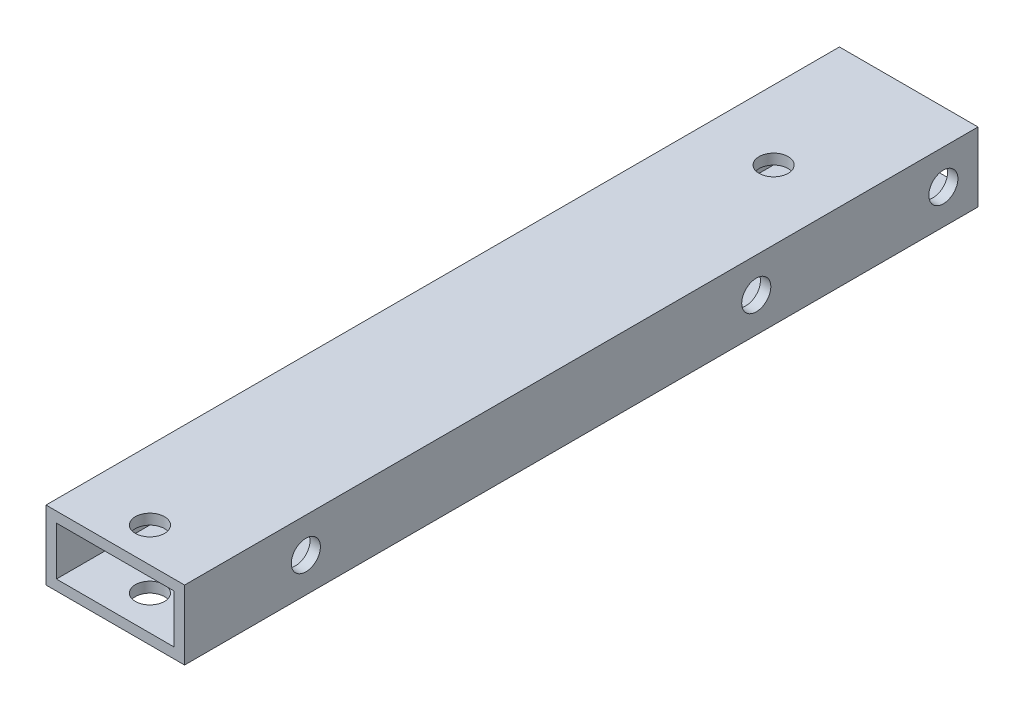
ISO-10303-21;
HEADER;
FILE_DESCRIPTION(('STEP AP214'),'2;1');
FILE_NAME('part.step','',(''),(''),'','','');
FILE_SCHEMA(('AUTOMOTIVE_DESIGN { 1 0 10303 214 1 1 1 1 }'));
ENDSEC;
DATA;
#1=APPLICATION_CONTEXT('core data for automotive mechanical design processes');
#2=APPLICATION_PROTOCOL_DEFINITION('international standard','automotive_design',2000,#1);
#3=PRODUCT_CONTEXT('',#1,'mechanical');
#4=PRODUCT('Part','Part','',(#3));
#5=PRODUCT_RELATED_PRODUCT_CATEGORY('part','',(#4));
#6=PRODUCT_DEFINITION_FORMATION('','',#4);
#7=PRODUCT_DEFINITION_CONTEXT('part definition',#1,'design');
#8=PRODUCT_DEFINITION('design','',#6,#7);
#9=PRODUCT_DEFINITION_SHAPE('','',#8);
#10=(LENGTH_UNIT() NAMED_UNIT(*) SI_UNIT(.MILLI.,.METRE.));
#11=(NAMED_UNIT(*) PLANE_ANGLE_UNIT() SI_UNIT($,.RADIAN.));
#12=(NAMED_UNIT(*) SI_UNIT($,.STERADIAN.) SOLID_ANGLE_UNIT());
#13=UNCERTAINTY_MEASURE_WITH_UNIT(LENGTH_MEASURE(1.E-05),#10,'distance_accuracy_value','');
#14=(GEOMETRIC_REPRESENTATION_CONTEXT(3) GLOBAL_UNCERTAINTY_ASSIGNED_CONTEXT((#13)) GLOBAL_UNIT_ASSIGNED_CONTEXT((#10,
#11,#12)) REPRESENTATION_CONTEXT('',''));
#15=CARTESIAN_POINT('',(0.,0.,0.));
#16=DIRECTION('',(0.,0.,1.));
#17=DIRECTION('',(1.,0.,0.));
#18=AXIS2_PLACEMENT_3D('',#15,#16,#17);
#19=CARTESIAN_POINT('',(0.,0.,114.5));
#20=DIRECTION('',(0.,0.,1.));
#21=DIRECTION('',(1.,0.,0.));
#22=AXIS2_PLACEMENT_3D('',#19,#20,#21);
#23=PLANE('',#22);
#24=DIRECTION('',(0.,1.,0.));
#25=VECTOR('',#24,1.);
#26=CARTESIAN_POINT('',(10.,5.,114.5));
#27=LINE('',#26,#25);
#28=CARTESIAN_POINT('',(10.,-5.,114.5));
#29=VERTEX_POINT('',#28);
#30=CARTESIAN_POINT('',(10.,5.,114.5));
#31=VERTEX_POINT('',#30);
#32=EDGE_CURVE('E164',#29,#31,#27,.T.);
#33=ORIENTED_EDGE('',*,*,#32,.T.);
#34=DIRECTION('',(-1.,0.,0.));
#35=VECTOR('',#34,1.);
#36=CARTESIAN_POINT('',(-10.,5.,114.5));
#37=LINE('',#36,#35);
#38=CARTESIAN_POINT('',(-10.,5.,114.5));
#39=VERTEX_POINT('',#38);
#40=EDGE_CURVE('E167',#31,#39,#37,.T.);
#41=ORIENTED_EDGE('',*,*,#40,.T.);
#42=DIRECTION('',(0.,-1.,0.));
#43=VECTOR('',#42,1.);
#44=CARTESIAN_POINT('',(-10.,5.,114.5));
#45=LINE('',#44,#43);
#46=CARTESIAN_POINT('',(-10.,-5.,114.5));
#47=VERTEX_POINT('',#46);
#48=EDGE_CURVE('E170',#39,#47,#45,.T.);
#49=ORIENTED_EDGE('',*,*,#48,.T.);
#50=DIRECTION('',(1.,0.,0.));
#51=VECTOR('',#50,1.);
#52=CARTESIAN_POINT('',(-10.,-5.,114.5));
#53=LINE('',#52,#51);
#54=EDGE_CURVE('E172',#47,#29,#53,.T.);
#55=ORIENTED_EDGE('',*,*,#54,.T.);
#56=EDGE_LOOP('',(#33,#41,#49,#55));
#57=FACE_BOUND('',#56,.T.);
#58=DIRECTION('',(-1.,0.,0.));
#59=VECTOR('',#58,1.);
#60=CARTESIAN_POINT('',(-10.,3.5,114.5));
#61=LINE('',#60,#59);
#62=CARTESIAN_POINT('',(8.5,3.5,114.5));
#63=VERTEX_POINT('',#62);
#64=CARTESIAN_POINT('',(-8.5,3.5,114.5));
#65=VERTEX_POINT('',#64);
#66=EDGE_CURVE('E134',#63,#65,#61,.T.);
#67=ORIENTED_EDGE('',*,*,#66,.F.);
#68=DIRECTION('',(0.,1.,0.));
#69=VECTOR('',#68,1.);
#70=CARTESIAN_POINT('',(8.5,5.,114.5));
#71=LINE('',#70,#69);
#72=CARTESIAN_POINT('',(8.5,-3.5,114.5));
#73=VERTEX_POINT('',#72);
#74=EDGE_CURVE('E126',#73,#63,#71,.T.);
#75=ORIENTED_EDGE('',*,*,#74,.F.);
#76=DIRECTION('',(1.,0.,0.));
#77=VECTOR('',#76,1.);
#78=CARTESIAN_POINT('',(-10.,-3.5,114.5));
#79=LINE('',#78,#77);
#80=CARTESIAN_POINT('',(-8.5,-3.5,114.5));
#81=VERTEX_POINT('',#80);
#82=EDGE_CURVE('E148',#81,#73,#79,.T.);
#83=ORIENTED_EDGE('',*,*,#82,.F.);
#84=DIRECTION('',(0.,-1.,0.));
#85=VECTOR('',#84,1.);
#86=CARTESIAN_POINT('',(-8.5,5.,114.5));
#87=LINE('',#86,#85);
#88=EDGE_CURVE('E146',#65,#81,#87,.T.);
#89=ORIENTED_EDGE('',*,*,#88,.F.);
#90=EDGE_LOOP('',(#67,#75,#83,#89));
#91=FACE_BOUND('',#90,.T.);
#92=ADVANCED_FACE('F59',(#57,#91),#23,.T.);
#93=CARTESIAN_POINT('',(0.,0.,0.));
#94=DIRECTION('',(0.,0.,1.));
#95=DIRECTION('',(1.,0.,0.));
#96=AXIS2_PLACEMENT_3D('',#93,#94,#95);
#97=PLANE('',#96);
#98=DIRECTION('',(0.,1.,0.));
#99=VECTOR('',#98,1.);
#100=CARTESIAN_POINT('',(10.,5.,0.));
#101=LINE('',#100,#99);
#102=CARTESIAN_POINT('',(10.,-5.,0.));
#103=VERTEX_POINT('',#102);
#104=CARTESIAN_POINT('',(10.,5.,0.));
#105=VERTEX_POINT('',#104);
#106=EDGE_CURVE('E142',#103,#105,#101,.T.);
#107=ORIENTED_EDGE('',*,*,#106,.F.);
#108=DIRECTION('',(1.,0.,0.));
#109=VECTOR('',#108,1.);
#110=CARTESIAN_POINT('',(-10.,-5.,0.));
#111=LINE('',#110,#109);
#112=CARTESIAN_POINT('',(-10.,-5.,0.));
#113=VERTEX_POINT('',#112);
#114=EDGE_CURVE('E168',#113,#103,#111,.T.);
#115=ORIENTED_EDGE('',*,*,#114,.F.);
#116=DIRECTION('',(0.,-1.,0.));
#117=VECTOR('',#116,1.);
#118=CARTESIAN_POINT('',(-10.,5.,0.));
#119=LINE('',#118,#117);
#120=CARTESIAN_POINT('',(-10.,5.,0.));
#121=VERTEX_POINT('',#120);
#122=EDGE_CURVE('E179',#121,#113,#119,.T.);
#123=ORIENTED_EDGE('',*,*,#122,.F.);
#124=DIRECTION('',(-1.,0.,0.));
#125=VECTOR('',#124,1.);
#126=CARTESIAN_POINT('',(-10.,5.,0.));
#127=LINE('',#126,#125);
#128=EDGE_CURVE('E177',#105,#121,#127,.T.);
#129=ORIENTED_EDGE('',*,*,#128,.F.);
#130=EDGE_LOOP('',(#107,#115,#123,#129));
#131=FACE_BOUND('',#130,.T.);
#132=DIRECTION('',(0.,1.,0.));
#133=VECTOR('',#132,1.);
#134=CARTESIAN_POINT('',(8.5,5.,0.));
#135=LINE('',#134,#133);
#136=CARTESIAN_POINT('',(8.5,-3.5,0.));
#137=VERTEX_POINT('',#136);
#138=CARTESIAN_POINT('',(8.5,3.5,0.));
#139=VERTEX_POINT('',#138);
#140=EDGE_CURVE('E84',#137,#139,#135,.T.);
#141=ORIENTED_EDGE('',*,*,#140,.T.);
#142=DIRECTION('',(-1.,0.,0.));
#143=VECTOR('',#142,1.);
#144=CARTESIAN_POINT('',(-10.,3.5,0.));
#145=LINE('',#144,#143);
#146=CARTESIAN_POINT('',(-8.5,3.5,0.));
#147=VERTEX_POINT('',#146);
#148=EDGE_CURVE('E141',#139,#147,#145,.T.);
#149=ORIENTED_EDGE('',*,*,#148,.T.);
#150=DIRECTION('',(0.,-1.,0.));
#151=VECTOR('',#150,1.);
#152=CARTESIAN_POINT('',(-8.5,5.,0.));
#153=LINE('',#152,#151);
#154=CARTESIAN_POINT('',(-8.5,-3.5,0.));
#155=VERTEX_POINT('',#154);
#156=EDGE_CURVE('E156',#147,#155,#153,.T.);
#157=ORIENTED_EDGE('',*,*,#156,.T.);
#158=DIRECTION('',(1.,0.,0.));
#159=VECTOR('',#158,1.);
#160=CARTESIAN_POINT('',(-10.,-3.5,0.));
#161=LINE('',#160,#159);
#162=EDGE_CURVE('E135',#155,#137,#161,.T.);
#163=ORIENTED_EDGE('',*,*,#162,.T.);
#164=EDGE_LOOP('',(#141,#149,#157,#163));
#165=FACE_BOUND('',#164,.T.);
#166=ADVANCED_FACE('F269',(#131,#165),#97,.F.);
#167=CARTESIAN_POINT('',(10.,5.,114.5));
#168=DIRECTION('',(-1.,0.,0.));
#169=DIRECTION('',(0.,-1.,0.));
#170=AXIS2_PLACEMENT_3D('',#167,#168,#169);
#171=PLANE('',#170);
#172=CARTESIAN_POINT('',(10.,0.,5.));
#173=DIRECTION('',(1.,0.,0.));
#174=DIRECTION('',(0.,1.,0.));
#175=AXIS2_PLACEMENT_3D('',#172,#173,#174);
#176=CIRCLE('',#175,2.1);
#177=CARTESIAN_POINT('',(10.,2.1,5.));
#178=VERTEX_POINT('',#177);
#179=EDGE_CURVE('E226',#178,#178,#176,.T.);
#180=ORIENTED_EDGE('',*,*,#179,.F.);
#181=EDGE_LOOP('',(#180));
#182=FACE_BOUND('',#181,.T.);
#183=CARTESIAN_POINT('',(10.,0.,97.));
#184=DIRECTION('',(1.,0.,0.));
#185=DIRECTION('',(0.,1.,0.));
#186=AXIS2_PLACEMENT_3D('',#183,#184,#185);
#187=CIRCLE('',#186,2.1);
#188=CARTESIAN_POINT('',(10.,2.1,97.));
#189=VERTEX_POINT('',#188);
#190=EDGE_CURVE('E236',#189,#189,#187,.T.);
#191=ORIENTED_EDGE('',*,*,#190,.F.);
#192=EDGE_LOOP('',(#191));
#193=FACE_BOUND('',#192,.T.);
#194=CARTESIAN_POINT('',(10.,0.,32.));
#195=DIRECTION('',(1.,0.,0.));
#196=DIRECTION('',(0.,-1.,0.));
#197=AXIS2_PLACEMENT_3D('',#194,#195,#196);
#198=CIRCLE('',#197,2.1);
#199=CARTESIAN_POINT('',(10.,-2.1,32.));
#200=VERTEX_POINT('',#199);
#201=EDGE_CURVE('E233',#200,#200,#198,.T.);
#202=ORIENTED_EDGE('',*,*,#201,.F.);
#203=EDGE_LOOP('',(#202));
#204=FACE_BOUND('',#203,.T.);
#205=ORIENTED_EDGE('',*,*,#106,.T.);
#206=DIRECTION('',(0.,0.,-1.));
#207=VECTOR('',#206,1.);
#208=CARTESIAN_POINT('',(10.,5.,114.5));
#209=LINE('',#208,#207);
#210=EDGE_CURVE('E12',#31,#105,#209,.T.);
#211=ORIENTED_EDGE('',*,*,#210,.F.);
#212=ORIENTED_EDGE('',*,*,#32,.F.);
#213=DIRECTION('',(0.,0.,-1.));
#214=VECTOR('',#213,1.);
#215=CARTESIAN_POINT('',(10.,-5.,114.5));
#216=LINE('',#215,#214);
#217=EDGE_CURVE('E174',#29,#103,#216,.T.);
#218=ORIENTED_EDGE('',*,*,#217,.T.);
#219=EDGE_LOOP('',(#205,#211,#212,#218));
#220=FACE_BOUND('',#219,.T.);
#221=ADVANCED_FACE('F61',(#182,#193,#204,#220),#171,.F.);
#222=CARTESIAN_POINT('',(-10.,5.,114.5));
#223=DIRECTION('',(0.,-1.,0.));
#224=DIRECTION('',(0.,0.,-1.));
#225=AXIS2_PLACEMENT_3D('',#222,#223,#224);
#226=PLANE('',#225);
#227=CARTESIAN_POINT('',(0.,5.,19.5));
#228=DIRECTION('',(0.,1.,0.));
#229=DIRECTION('',(0.,0.,1.));
#230=AXIS2_PLACEMENT_3D('',#227,#228,#229);
#231=CIRCLE('',#230,2.1);
#232=CARTESIAN_POINT('',(0.,5.,21.6));
#233=VERTEX_POINT('',#232);
#234=EDGE_CURVE('E210',#233,#233,#231,.T.);
#235=ORIENTED_EDGE('',*,*,#234,.F.);
#236=EDGE_LOOP('',(#235));
#237=FACE_BOUND('',#236,.T.);
#238=CARTESIAN_POINT('',(0.,5.,109.5));
#239=DIRECTION('',(0.,1.,0.));
#240=DIRECTION('',(0.,0.,1.));
#241=AXIS2_PLACEMENT_3D('',#238,#239,#240);
#242=CIRCLE('',#241,2.1);
#243=CARTESIAN_POINT('',(0.,5.,111.6));
#244=VERTEX_POINT('',#243);
#245=EDGE_CURVE('E220',#244,#244,#242,.T.);
#246=ORIENTED_EDGE('',*,*,#245,.F.);
#247=EDGE_LOOP('',(#246));
#248=FACE_BOUND('',#247,.T.);
#249=ORIENTED_EDGE('',*,*,#128,.T.);
#250=DIRECTION('',(0.,0.,-1.));
#251=VECTOR('',#250,1.);
#252=CARTESIAN_POINT('',(-10.,5.,114.5));
#253=LINE('',#252,#251);
#254=EDGE_CURVE('E68',#39,#121,#253,.T.);
#255=ORIENTED_EDGE('',*,*,#254,.F.);
#256=ORIENTED_EDGE('',*,*,#40,.F.);
#257=ORIENTED_EDGE('',*,*,#210,.T.);
#258=EDGE_LOOP('',(#249,#255,#256,#257));
#259=FACE_BOUND('',#258,.T.);
#260=ADVANCED_FACE('F268',(#237,#248,#259),#226,.F.);
#261=CARTESIAN_POINT('',(-10.,5.,114.5));
#262=DIRECTION('',(1.,0.,0.));
#263=DIRECTION('',(0.,1.,0.));
#264=AXIS2_PLACEMENT_3D('',#261,#262,#263);
#265=PLANE('',#264);
#266=CARTESIAN_POINT('',(-10.,0.,5.));
#267=DIRECTION('',(1.,0.,0.));
#268=DIRECTION('',(0.,1.,0.));
#269=AXIS2_PLACEMENT_3D('',#266,#267,#268);
#270=CIRCLE('',#269,2.1);
#271=CARTESIAN_POINT('',(-10.,2.1,5.));
#272=VERTEX_POINT('',#271);
#273=EDGE_CURVE('E200',#272,#272,#270,.T.);
#274=ORIENTED_EDGE('',*,*,#273,.T.);
#275=EDGE_LOOP('',(#274));
#276=FACE_BOUND('',#275,.T.);
#277=CARTESIAN_POINT('',(-10.,0.,97.));
#278=DIRECTION('',(1.,0.,0.));
#279=DIRECTION('',(0.,1.,0.));
#280=AXIS2_PLACEMENT_3D('',#277,#278,#279);
#281=CIRCLE('',#280,2.1);
#282=CARTESIAN_POINT('',(-10.,2.1,97.));
#283=VERTEX_POINT('',#282);
#284=EDGE_CURVE('E193',#283,#283,#281,.T.);
#285=ORIENTED_EDGE('',*,*,#284,.T.);
#286=EDGE_LOOP('',(#285));
#287=FACE_BOUND('',#286,.T.);
#288=CARTESIAN_POINT('',(-10.,0.,32.));
#289=DIRECTION('',(1.,0.,0.));
#290=DIRECTION('',(0.,-1.,0.));
#291=AXIS2_PLACEMENT_3D('',#288,#289,#290);
#292=CIRCLE('',#291,2.1);
#293=CARTESIAN_POINT('',(-10.,-2.1,32.));
#294=VERTEX_POINT('',#293);
#295=EDGE_CURVE('E239',#294,#294,#292,.T.);
#296=ORIENTED_EDGE('',*,*,#295,.T.);
#297=EDGE_LOOP('',(#296));
#298=FACE_BOUND('',#297,.T.);
#299=ORIENTED_EDGE('',*,*,#122,.T.);
#300=DIRECTION('',(0.,0.,-1.));
#301=VECTOR('',#300,1.);
#302=CARTESIAN_POINT('',(-10.,-5.,114.5));
#303=LINE('',#302,#301);
#304=EDGE_CURVE('E184',#47,#113,#303,.T.);
#305=ORIENTED_EDGE('',*,*,#304,.F.);
#306=ORIENTED_EDGE('',*,*,#48,.F.);
#307=ORIENTED_EDGE('',*,*,#254,.T.);
#308=EDGE_LOOP('',(#299,#305,#306,#307));
#309=FACE_BOUND('',#308,.T.);
#310=ADVANCED_FACE('F287',(#276,#287,#298,#309),#265,.F.);
#311=CARTESIAN_POINT('',(-10.,-5.,114.5));
#312=DIRECTION('',(0.,1.,0.));
#313=DIRECTION('',(0.,0.,1.));
#314=AXIS2_PLACEMENT_3D('',#311,#312,#313);
#315=PLANE('',#314);
#316=CARTESIAN_POINT('',(0.,-5.,19.5));
#317=DIRECTION('',(0.,1.,0.));
#318=DIRECTION('',(0.,0.,1.));
#319=AXIS2_PLACEMENT_3D('',#316,#317,#318);
#320=CIRCLE('',#319,2.1);
#321=CARTESIAN_POINT('',(0.,-5.,21.6));
#322=VERTEX_POINT('',#321);
#323=EDGE_CURVE('E204',#322,#322,#320,.T.);
#324=ORIENTED_EDGE('',*,*,#323,.T.);
#325=EDGE_LOOP('',(#324));
#326=FACE_BOUND('',#325,.T.);
#327=CARTESIAN_POINT('',(0.,-5.,109.5));
#328=DIRECTION('',(0.,1.,0.));
#329=DIRECTION('',(0.,0.,1.));
#330=AXIS2_PLACEMENT_3D('',#327,#328,#329);
#331=CIRCLE('',#330,2.1);
#332=CARTESIAN_POINT('',(0.,-5.,111.6));
#333=VERTEX_POINT('',#332);
#334=EDGE_CURVE('E215',#333,#333,#331,.T.);
#335=ORIENTED_EDGE('',*,*,#334,.T.);
#336=EDGE_LOOP('',(#335));
#337=FACE_BOUND('',#336,.T.);
#338=ORIENTED_EDGE('',*,*,#114,.T.);
#339=ORIENTED_EDGE('',*,*,#217,.F.);
#340=ORIENTED_EDGE('',*,*,#54,.F.);
#341=ORIENTED_EDGE('',*,*,#304,.T.);
#342=EDGE_LOOP('',(#338,#339,#340,#341));
#343=FACE_BOUND('',#342,.T.);
#344=ADVANCED_FACE('F253',(#326,#337,#343),#315,.F.);
#345=CARTESIAN_POINT('',(8.5,5.,114.5));
#346=DIRECTION('',(-1.,0.,0.));
#347=DIRECTION('',(0.,-1.,0.));
#348=AXIS2_PLACEMENT_3D('',#345,#346,#347);
#349=PLANE('',#348);
#350=CARTESIAN_POINT('',(8.5,0.,5.));
#351=DIRECTION('',(-1.,0.,0.));
#352=DIRECTION('',(0.,-1.,0.));
#353=AXIS2_PLACEMENT_3D('',#350,#351,#352);
#354=CIRCLE('',#353,2.1);
#355=CARTESIAN_POINT('',(8.5,2.1,5.));
#356=VERTEX_POINT('',#355);
#357=EDGE_CURVE('E199',#356,#356,#354,.T.);
#358=ORIENTED_EDGE('',*,*,#357,.F.);
#359=EDGE_LOOP('',(#358));
#360=FACE_BOUND('',#359,.T.);
#361=CARTESIAN_POINT('',(8.5,0.,97.));
#362=DIRECTION('',(-1.,0.,0.));
#363=DIRECTION('',(0.,-1.,0.));
#364=AXIS2_PLACEMENT_3D('',#361,#362,#363);
#365=CIRCLE('',#364,2.1);
#366=CARTESIAN_POINT('',(8.5,-2.10000000000001,97.));
#367=VERTEX_POINT('',#366);
#368=EDGE_CURVE('E154',#367,#367,#365,.T.);
#369=ORIENTED_EDGE('',*,*,#368,.F.);
#370=EDGE_LOOP('',(#369));
#371=FACE_BOUND('',#370,.T.);
#372=CARTESIAN_POINT('',(8.5,0.,32.));
#373=DIRECTION('',(-1.,0.,0.));
#374=DIRECTION('',(0.,-1.,0.));
#375=AXIS2_PLACEMENT_3D('',#372,#373,#374);
#376=CIRCLE('',#375,2.1);
#377=CARTESIAN_POINT('',(8.5,-2.1,32.));
#378=VERTEX_POINT('',#377);
#379=EDGE_CURVE('E192',#378,#378,#376,.T.);
#380=ORIENTED_EDGE('',*,*,#379,.F.);
#381=EDGE_LOOP('',(#380));
#382=FACE_BOUND('',#381,.T.);
#383=ORIENTED_EDGE('',*,*,#140,.F.);
#384=DIRECTION('',(0.,0.,-1.));
#385=VECTOR('',#384,1.);
#386=CARTESIAN_POINT('',(8.5,-3.5,114.5));
#387=LINE('',#386,#385);
#388=EDGE_CURVE('E130',#73,#137,#387,.T.);
#389=ORIENTED_EDGE('',*,*,#388,.F.);
#390=ORIENTED_EDGE('',*,*,#74,.T.);
#391=DIRECTION('',(0.,0.,-1.));
#392=VECTOR('',#391,1.);
#393=CARTESIAN_POINT('',(8.5,3.5,114.5));
#394=LINE('',#393,#392);
#395=EDGE_CURVE('E129',#63,#139,#394,.T.);
#396=ORIENTED_EDGE('',*,*,#395,.T.);
#397=EDGE_LOOP('',(#383,#389,#390,#396));
#398=FACE_BOUND('',#397,.T.);
#399=ADVANCED_FACE('F128',(#360,#371,#382,#398),#349,.T.);
#400=CARTESIAN_POINT('',(-10.,3.5,114.5));
#401=DIRECTION('',(0.,-1.,0.));
#402=DIRECTION('',(0.,0.,-1.));
#403=AXIS2_PLACEMENT_3D('',#400,#401,#402);
#404=PLANE('',#403);
#405=CARTESIAN_POINT('',(0.,3.5,19.5));
#406=DIRECTION('',(0.,-1.,0.));
#407=DIRECTION('',(0.,0.,-1.));
#408=AXIS2_PLACEMENT_3D('',#405,#406,#407);
#409=CIRCLE('',#408,2.1);
#410=CARTESIAN_POINT('',(0.,3.5,17.4));
#411=VERTEX_POINT('',#410);
#412=EDGE_CURVE('E223',#411,#411,#409,.T.);
#413=ORIENTED_EDGE('',*,*,#412,.F.);
#414=EDGE_LOOP('',(#413));
#415=FACE_BOUND('',#414,.T.);
#416=CARTESIAN_POINT('',(0.,3.5,109.5));
#417=DIRECTION('',(0.,-1.,0.));
#418=DIRECTION('',(0.,0.,-1.));
#419=AXIS2_PLACEMENT_3D('',#416,#417,#418);
#420=CIRCLE('',#419,2.1);
#421=CARTESIAN_POINT('',(0.,3.5,107.4));
#422=VERTEX_POINT('',#421);
#423=EDGE_CURVE('E203',#422,#422,#420,.T.);
#424=ORIENTED_EDGE('',*,*,#423,.F.);
#425=EDGE_LOOP('',(#424));
#426=FACE_BOUND('',#425,.T.);
#427=ORIENTED_EDGE('',*,*,#148,.F.);
#428=ORIENTED_EDGE('',*,*,#395,.F.);
#429=ORIENTED_EDGE('',*,*,#66,.T.);
#430=DIRECTION('',(0.,0.,-1.));
#431=VECTOR('',#430,1.);
#432=CARTESIAN_POINT('',(-8.5,3.5,114.5));
#433=LINE('',#432,#431);
#434=EDGE_CURVE('E143',#65,#147,#433,.T.);
#435=ORIENTED_EDGE('',*,*,#434,.T.);
#436=EDGE_LOOP('',(#427,#428,#429,#435));
#437=FACE_BOUND('',#436,.T.);
#438=ADVANCED_FACE('F138',(#415,#426,#437),#404,.T.);
#439=CARTESIAN_POINT('',(-8.5,5.,114.5));
#440=DIRECTION('',(1.,0.,0.));
#441=DIRECTION('',(0.,1.,0.));
#442=AXIS2_PLACEMENT_3D('',#439,#440,#441);
#443=PLANE('',#442);
#444=CARTESIAN_POINT('',(-8.5,0.,5.));
#445=DIRECTION('',(1.,0.,0.));
#446=DIRECTION('',(0.,1.,0.));
#447=AXIS2_PLACEMENT_3D('',#444,#445,#446);
#448=CIRCLE('',#447,2.1);
#449=CARTESIAN_POINT('',(-8.5,2.1,5.));
#450=VERTEX_POINT('',#449);
#451=EDGE_CURVE('E197',#450,#450,#448,.T.);
#452=ORIENTED_EDGE('',*,*,#451,.F.);
#453=EDGE_LOOP('',(#452));
#454=FACE_BOUND('',#453,.T.);
#455=CARTESIAN_POINT('',(-8.5,0.,97.));
#456=DIRECTION('',(1.,0.,0.));
#457=DIRECTION('',(0.,1.,0.));
#458=AXIS2_PLACEMENT_3D('',#455,#456,#457);
#459=CIRCLE('',#458,2.1);
#460=CARTESIAN_POINT('',(-8.5,2.1,97.));
#461=VERTEX_POINT('',#460);
#462=EDGE_CURVE('E194',#461,#461,#459,.T.);
#463=ORIENTED_EDGE('',*,*,#462,.F.);
#464=EDGE_LOOP('',(#463));
#465=FACE_BOUND('',#464,.T.);
#466=CARTESIAN_POINT('',(-8.5,0.,32.));
#467=DIRECTION('',(1.,0.,0.));
#468=DIRECTION('',(0.,1.,0.));
#469=AXIS2_PLACEMENT_3D('',#466,#467,#468);
#470=CIRCLE('',#469,2.1);
#471=CARTESIAN_POINT('',(-8.5,2.10000000000001,32.));
#472=VERTEX_POINT('',#471);
#473=EDGE_CURVE('E189',#472,#472,#470,.T.);
#474=ORIENTED_EDGE('',*,*,#473,.F.);
#475=EDGE_LOOP('',(#474));
#476=FACE_BOUND('',#475,.T.);
#477=ORIENTED_EDGE('',*,*,#156,.F.);
#478=ORIENTED_EDGE('',*,*,#434,.F.);
#479=ORIENTED_EDGE('',*,*,#88,.T.);
#480=DIRECTION('',(0.,0.,-1.));
#481=VECTOR('',#480,1.);
#482=CARTESIAN_POINT('',(-8.5,-3.5,114.5));
#483=LINE('',#482,#481);
#484=EDGE_CURVE('E76',#81,#155,#483,.T.);
#485=ORIENTED_EDGE('',*,*,#484,.T.);
#486=EDGE_LOOP('',(#477,#478,#479,#485));
#487=FACE_BOUND('',#486,.T.);
#488=ADVANCED_FACE('F307',(#454,#465,#476,#487),#443,.T.);
#489=CARTESIAN_POINT('',(-10.,-3.5,114.5));
#490=DIRECTION('',(0.,1.,0.));
#491=DIRECTION('',(0.,0.,1.));
#492=AXIS2_PLACEMENT_3D('',#489,#490,#491);
#493=PLANE('',#492);
#494=CARTESIAN_POINT('',(0.,-3.5,19.5));
#495=DIRECTION('',(0.,1.,0.));
#496=DIRECTION('',(0.,0.,1.));
#497=AXIS2_PLACEMENT_3D('',#494,#495,#496);
#498=CIRCLE('',#497,2.1);
#499=CARTESIAN_POINT('',(0.,-3.5,21.6));
#500=VERTEX_POINT('',#499);
#501=EDGE_CURVE('E63',#500,#500,#498,.T.);
#502=ORIENTED_EDGE('',*,*,#501,.F.);
#503=EDGE_LOOP('',(#502));
#504=FACE_BOUND('',#503,.T.);
#505=CARTESIAN_POINT('',(0.,-3.5,109.5));
#506=DIRECTION('',(0.,1.,0.));
#507=DIRECTION('',(0.,0.,1.));
#508=AXIS2_PLACEMENT_3D('',#505,#506,#507);
#509=CIRCLE('',#508,2.1);
#510=CARTESIAN_POINT('',(0.,-3.5,111.6));
#511=VERTEX_POINT('',#510);
#512=EDGE_CURVE('E201',#511,#511,#509,.T.);
#513=ORIENTED_EDGE('',*,*,#512,.F.);
#514=EDGE_LOOP('',(#513));
#515=FACE_BOUND('',#514,.T.);
#516=ORIENTED_EDGE('',*,*,#162,.F.);
#517=ORIENTED_EDGE('',*,*,#484,.F.);
#518=ORIENTED_EDGE('',*,*,#82,.T.);
#519=ORIENTED_EDGE('',*,*,#388,.T.);
#520=EDGE_LOOP('',(#516,#517,#518,#519));
#521=FACE_BOUND('',#520,.T.);
#522=ADVANCED_FACE('F311',(#504,#515,#521),#493,.T.);
#523=CARTESIAN_POINT('',(-10.,0.,32.));
#524=DIRECTION('',(1.,0.,0.));
#525=DIRECTION('',(0.,1.,0.));
#526=AXIS2_PLACEMENT_3D('',#523,#524,#525);
#527=CYLINDRICAL_SURFACE('',#526,2.1);
#528=ORIENTED_EDGE('',*,*,#473,.T.);
#529=EDGE_LOOP('',(#528));
#530=FACE_BOUND('',#529,.T.);
#531=ORIENTED_EDGE('',*,*,#295,.F.);
#532=EDGE_LOOP('',(#531));
#533=FACE_BOUND('',#532,.T.);
#534=ADVANCED_FACE('F263',(#530,#533),#527,.F.);
#535=CARTESIAN_POINT('',(-10.,0.,97.));
#536=DIRECTION('',(1.,0.,0.));
#537=DIRECTION('',(0.,1.,0.));
#538=AXIS2_PLACEMENT_3D('',#535,#536,#537);
#539=CYLINDRICAL_SURFACE('',#538,2.1);
#540=ORIENTED_EDGE('',*,*,#462,.T.);
#541=EDGE_LOOP('',(#540));
#542=FACE_BOUND('',#541,.T.);
#543=ORIENTED_EDGE('',*,*,#284,.F.);
#544=EDGE_LOOP('',(#543));
#545=FACE_BOUND('',#544,.T.);
#546=ADVANCED_FACE('F261',(#542,#545),#539,.F.);
#547=ORIENTED_EDGE('',*,*,#379,.T.);
#548=EDGE_LOOP('',(#547));
#549=FACE_BOUND('',#548,.T.);
#550=ORIENTED_EDGE('',*,*,#201,.T.);
#551=EDGE_LOOP('',(#550));
#552=FACE_BOUND('',#551,.T.);
#553=ADVANCED_FACE('F258',(#549,#552),#527,.F.);
#554=ORIENTED_EDGE('',*,*,#368,.T.);
#555=EDGE_LOOP('',(#554));
#556=FACE_BOUND('',#555,.T.);
#557=ORIENTED_EDGE('',*,*,#190,.T.);
#558=EDGE_LOOP('',(#557));
#559=FACE_BOUND('',#558,.T.);
#560=ADVANCED_FACE('F248',(#556,#559),#539,.F.);
#561=CARTESIAN_POINT('',(-10.,0.,5.));
#562=DIRECTION('',(1.,0.,0.));
#563=DIRECTION('',(0.,1.,0.));
#564=AXIS2_PLACEMENT_3D('',#561,#562,#563);
#565=CYLINDRICAL_SURFACE('',#564,2.1);
#566=CARTESIAN_POINT('',(-8.5,2.1,5.));
#567=CARTESIAN_POINT('',(-8.515625,2.1,5.));
#568=CARTESIAN_POINT('',(-8.53125,2.1,5.));
#569=CARTESIAN_POINT('',(-8.5625,2.1,5.));
#570=CARTESIAN_POINT('',(-8.578125,2.1,5.));
#571=CARTESIAN_POINT('',(-8.609375,2.1,5.));
#572=CARTESIAN_POINT('',(-8.625,2.1,5.));
#573=CARTESIAN_POINT('',(-8.65625,2.1,5.));
#574=CARTESIAN_POINT('',(-8.671875,2.1,5.));
#575=CARTESIAN_POINT('',(-8.703125,2.1,5.));
#576=CARTESIAN_POINT('',(-8.71875,2.1,5.));
#577=CARTESIAN_POINT('',(-8.75,2.1,5.));
#578=CARTESIAN_POINT('',(-8.765625,2.1,5.));
#579=CARTESIAN_POINT('',(-8.796875,2.1,5.));
#580=CARTESIAN_POINT('',(-8.8125,2.1,5.));
#581=CARTESIAN_POINT('',(-8.84375,2.1,5.));
#582=CARTESIAN_POINT('',(-8.859375,2.1,5.));
#583=CARTESIAN_POINT('',(-8.890625,2.1,5.));
#584=CARTESIAN_POINT('',(-8.90625,2.1,5.));
#585=CARTESIAN_POINT('',(-8.9375,2.1,5.));
#586=CARTESIAN_POINT('',(-8.953125,2.1,5.));
#587=CARTESIAN_POINT('',(-8.984375,2.1,5.));
#588=CARTESIAN_POINT('',(-9.,2.1,5.));
#589=CARTESIAN_POINT('',(-9.03125,2.1,5.));
#590=CARTESIAN_POINT('',(-9.046875,2.1,5.));
#591=CARTESIAN_POINT('',(-9.078125,2.1,5.));
#592=CARTESIAN_POINT('',(-9.09375,2.1,5.));
#593=CARTESIAN_POINT('',(-9.125,2.1,5.));
#594=CARTESIAN_POINT('',(-9.140625,2.1,5.));
#595=CARTESIAN_POINT('',(-9.171875,2.1,5.));
#596=CARTESIAN_POINT('',(-9.1875,2.1,5.));
#597=CARTESIAN_POINT('',(-9.21875,2.1,5.));
#598=CARTESIAN_POINT('',(-9.23437500000001,2.1,5.));
#599=CARTESIAN_POINT('',(-9.26562500000001,2.1,5.));
#600=CARTESIAN_POINT('',(-9.28125000000001,2.1,5.));
#601=CARTESIAN_POINT('',(-9.31250000000001,2.1,5.));
#602=CARTESIAN_POINT('',(-9.32812500000001,2.1,5.));
#603=CARTESIAN_POINT('',(-9.35937500000001,2.1,5.));
#604=CARTESIAN_POINT('',(-9.37500000000001,2.1,5.));
#605=CARTESIAN_POINT('',(-9.40625000000001,2.1,5.));
#606=CARTESIAN_POINT('',(-9.42187500000001,2.1,5.));
#607=CARTESIAN_POINT('',(-9.45312500000001,2.1,5.));
#608=CARTESIAN_POINT('',(-9.46875000000001,2.1,5.));
#609=CARTESIAN_POINT('',(-9.50000000000001,2.1,5.));
#610=CARTESIAN_POINT('',(-9.51562500000001,2.1,5.));
#611=CARTESIAN_POINT('',(-9.54687500000001,2.1,5.));
#612=CARTESIAN_POINT('',(-9.56250000000001,2.1,5.));
#613=CARTESIAN_POINT('',(-9.59375000000001,2.1,5.));
#614=CARTESIAN_POINT('',(-9.60937500000001,2.1,5.));
#615=CARTESIAN_POINT('',(-9.64062500000001,2.1,5.));
#616=CARTESIAN_POINT('',(-9.65625000000001,2.1,5.));
#617=CARTESIAN_POINT('',(-9.68750000000001,2.1,5.));
#618=CARTESIAN_POINT('',(-9.70312500000001,2.1,5.));
#619=CARTESIAN_POINT('',(-9.73437500000001,2.1,5.));
#620=CARTESIAN_POINT('',(-9.75000000000001,2.1,5.));
#621=CARTESIAN_POINT('',(-9.78125000000001,2.1,5.));
#622=CARTESIAN_POINT('',(-9.79687500000001,2.1,5.));
#623=CARTESIAN_POINT('',(-9.82812500000001,2.1,5.));
#624=CARTESIAN_POINT('',(-9.84375000000001,2.1,5.));
#625=CARTESIAN_POINT('',(-9.87500000000001,2.1,5.));
#626=CARTESIAN_POINT('',(-9.89062500000001,2.1,5.));
#627=CARTESIAN_POINT('',(-9.92187500000001,2.1,5.));
#628=CARTESIAN_POINT('',(-9.93750000000001,2.1,5.));
#629=CARTESIAN_POINT('',(-9.96875000000001,2.1,5.));
#630=CARTESIAN_POINT('',(-9.98437500000001,2.1,5.));
#631=CARTESIAN_POINT('',(-10.,2.1,5.));
#632=B_SPLINE_CURVE_WITH_KNOTS('',3,(#566,#567,#568,#569,#570,#571,#572,#573,#574,#575,#576,
#577,#578,#579,#580,#581,#582,#583,#584,#585,#586,#587,#588,#589,#590,#591,#592,#593,#594,#595,
#596,#597,#598,#599,#600,#601,#602,#603,#604,#605,#606,#607,#608,#609,#610,#611,#612,#613,#614,
#615,#616,#617,#618,#619,#620,#621,#622,#623,#624,#625,#626,#627,#628,#629,#630,#631),
.UNSPECIFIED.,.F.,.F.,(4,2,2,2,2,2,2,2,2,2,2,2,2,2,2,2,2,2,2,2,2,2,2,2,2,2,2,2,2,2,2,2,4),(0.,
0.046875,0.0937500000000001,0.140625,0.1875,0.234375,0.28125,0.328125,0.375,0.421875,0.46875,
0.515625,0.5625,0.609375000000001,0.656250000000001,0.703125000000001,0.750000000000002,
0.796875000000002,0.843750000000002,0.890625000000003,0.937500000000003,0.984375000000003,
1.03125,1.078125,1.125,1.171875,1.21875,1.265625,1.3125,1.359375,1.40625,1.453125,1.5),.UNSPECIFIED.);
#633=EDGE_CURVE('BSEAM321',#450,#272,#632,.T.);
#634=ORIENTED_EDGE('',*,*,#451,.T.);
#635=ORIENTED_EDGE('',*,*,#273,.F.);
#636=ORIENTED_EDGE('',*,*,#633,.T.);
#637=ORIENTED_EDGE('',*,*,#633,.F.);
#638=EDGE_LOOP('',(#634,#636,#635,#637));
#639=FACE_BOUND('',#638,.T.);
#640=ADVANCED_FACE('F321',(#639),#565,.F.);
#641=CARTESIAN_POINT('',(8.5,2.1,5.));
#642=CARTESIAN_POINT('',(8.515625,2.1,5.));
#643=CARTESIAN_POINT('',(8.53125,2.1,5.));
#644=CARTESIAN_POINT('',(8.5625,2.1,5.));
#645=CARTESIAN_POINT('',(8.578125,2.1,5.));
#646=CARTESIAN_POINT('',(8.609375,2.1,5.));
#647=CARTESIAN_POINT('',(8.625,2.1,5.));
#648=CARTESIAN_POINT('',(8.65625,2.1,5.));
#649=CARTESIAN_POINT('',(8.671875,2.1,5.));
#650=CARTESIAN_POINT('',(8.703125,2.1,5.));
#651=CARTESIAN_POINT('',(8.71875,2.1,5.));
#652=CARTESIAN_POINT('',(8.75,2.1,5.));
#653=CARTESIAN_POINT('',(8.765625,2.1,5.));
#654=CARTESIAN_POINT('',(8.796875,2.1,5.));
#655=CARTESIAN_POINT('',(8.8125,2.1,5.));
#656=CARTESIAN_POINT('',(8.84375,2.1,5.));
#657=CARTESIAN_POINT('',(8.859375,2.1,5.));
#658=CARTESIAN_POINT('',(8.890625,2.1,5.));
#659=CARTESIAN_POINT('',(8.90625,2.1,5.));
#660=CARTESIAN_POINT('',(8.9375,2.1,5.));
#661=CARTESIAN_POINT('',(8.953125,2.1,5.));
#662=CARTESIAN_POINT('',(8.984375,2.1,5.));
#663=CARTESIAN_POINT('',(9.,2.1,5.));
#664=CARTESIAN_POINT('',(9.03125,2.1,5.));
#665=CARTESIAN_POINT('',(9.046875,2.1,5.));
#666=CARTESIAN_POINT('',(9.078125,2.1,5.));
#667=CARTESIAN_POINT('',(9.09375,2.1,5.));
#668=CARTESIAN_POINT('',(9.125,2.1,5.));
#669=CARTESIAN_POINT('',(9.140625,2.1,5.));
#670=CARTESIAN_POINT('',(9.171875,2.1,5.));
#671=CARTESIAN_POINT('',(9.1875,2.1,5.));
#672=CARTESIAN_POINT('',(9.21875,2.1,5.));
#673=CARTESIAN_POINT('',(9.234375,2.1,5.));
#674=CARTESIAN_POINT('',(9.265625,2.1,5.));
#675=CARTESIAN_POINT('',(9.28125,2.1,5.));
#676=CARTESIAN_POINT('',(9.3125,2.1,5.));
#677=CARTESIAN_POINT('',(9.328125,2.1,5.));
#678=CARTESIAN_POINT('',(9.359375,2.1,5.));
#679=CARTESIAN_POINT('',(9.375,2.1,5.));
#680=CARTESIAN_POINT('',(9.40625,2.1,5.));
#681=CARTESIAN_POINT('',(9.421875,2.1,5.));
#682=CARTESIAN_POINT('',(9.453125,2.1,5.));
#683=CARTESIAN_POINT('',(9.46875,2.1,5.));
#684=CARTESIAN_POINT('',(9.5,2.1,5.));
#685=CARTESIAN_POINT('',(9.515625,2.1,5.));
#686=CARTESIAN_POINT('',(9.546875,2.1,5.));
#687=CARTESIAN_POINT('',(9.5625,2.1,5.));
#688=CARTESIAN_POINT('',(9.59375,2.1,5.));
#689=CARTESIAN_POINT('',(9.609375,2.1,5.));
#690=CARTESIAN_POINT('',(9.640625,2.1,5.));
#691=CARTESIAN_POINT('',(9.65625,2.1,5.));
#692=CARTESIAN_POINT('',(9.6875,2.1,5.));
#693=CARTESIAN_POINT('',(9.703125,2.1,5.));
#694=CARTESIAN_POINT('',(9.734375,2.1,5.));
#695=CARTESIAN_POINT('',(9.75,2.1,5.));
#696=CARTESIAN_POINT('',(9.78125,2.1,5.));
#697=CARTESIAN_POINT('',(9.796875,2.1,5.));
#698=CARTESIAN_POINT('',(9.828125,2.1,5.));
#699=CARTESIAN_POINT('',(9.84375,2.1,5.));
#700=CARTESIAN_POINT('',(9.875,2.1,5.));
#701=CARTESIAN_POINT('',(9.890625,2.1,5.));
#702=CARTESIAN_POINT('',(9.921875,2.1,5.));
#703=CARTESIAN_POINT('',(9.9375,2.1,5.));
#704=CARTESIAN_POINT('',(9.96875,2.1,5.));
#705=CARTESIAN_POINT('',(9.984375,2.1,5.));
#706=CARTESIAN_POINT('',(10.,2.1,5.));
#707=B_SPLINE_CURVE_WITH_KNOTS('',3,(#641,#642,#643,#644,#645,#646,#647,#648,#649,#650,#651,
#652,#653,#654,#655,#656,#657,#658,#659,#660,#661,#662,#663,#664,#665,#666,#667,#668,#669,#670,
#671,#672,#673,#674,#675,#676,#677,#678,#679,#680,#681,#682,#683,#684,#685,#686,#687,#688,#689,
#690,#691,#692,#693,#694,#695,#696,#697,#698,#699,#700,#701,#702,#703,#704,#705,#706),
.UNSPECIFIED.,.F.,.F.,(4,2,2,2,2,2,2,2,2,2,2,2,2,2,2,2,2,2,2,2,2,2,2,2,2,2,2,2,2,2,2,2,4),(0.,
0.0468750000000018,0.0937500000000001,0.140624999999998,0.1875,0.234375000000002,0.28125,
0.328124999999999,0.375,0.421875000000002,0.46875,0.515624999999999,0.5625,0.609375000000002,
0.656250000000001,0.703124999999999,0.750000000000001,0.796875000000002,0.843750000000001,
0.890624999999999,0.937500000000001,0.984375000000003,1.03125,1.078125,1.125,1.171875,1.21875,
1.265625,1.3125,1.359375,1.40625,1.453125,1.5),.UNSPECIFIED.);
#708=EDGE_CURVE('BSEAM324',#356,#178,#707,.T.);
#709=ORIENTED_EDGE('',*,*,#357,.T.);
#710=ORIENTED_EDGE('',*,*,#179,.T.);
#711=ORIENTED_EDGE('',*,*,#708,.T.);
#712=ORIENTED_EDGE('',*,*,#708,.F.);
#713=EDGE_LOOP('',(#709,#711,#710,#712));
#714=FACE_BOUND('',#713,.T.);
#715=ADVANCED_FACE('F324',(#714),#565,.F.);
#716=CARTESIAN_POINT('',(0.,-5.,109.5));
#717=DIRECTION('',(0.,1.,0.));
#718=DIRECTION('',(0.,0.,1.));
#719=AXIS2_PLACEMENT_3D('',#716,#717,#718);
#720=CYLINDRICAL_SURFACE('',#719,2.1);
#721=ORIENTED_EDGE('',*,*,#512,.T.);
#722=EDGE_LOOP('',(#721));
#723=FACE_BOUND('',#722,.T.);
#724=ORIENTED_EDGE('',*,*,#334,.F.);
#725=EDGE_LOOP('',(#724));
#726=FACE_BOUND('',#725,.T.);
#727=ADVANCED_FACE('F326',(#723,#726),#720,.F.);
#728=CARTESIAN_POINT('',(0.,-5.,19.5));
#729=DIRECTION('',(0.,1.,0.));
#730=DIRECTION('',(0.,0.,1.));
#731=AXIS2_PLACEMENT_3D('',#728,#729,#730);
#732=CYLINDRICAL_SURFACE('',#731,2.1);
#733=ORIENTED_EDGE('',*,*,#501,.T.);
#734=EDGE_LOOP('',(#733));
#735=FACE_BOUND('',#734,.T.);
#736=ORIENTED_EDGE('',*,*,#323,.F.);
#737=EDGE_LOOP('',(#736));
#738=FACE_BOUND('',#737,.T.);
#739=ADVANCED_FACE('F329',(#735,#738),#732,.F.);
#740=ORIENTED_EDGE('',*,*,#423,.T.);
#741=EDGE_LOOP('',(#740));
#742=FACE_BOUND('',#741,.T.);
#743=ORIENTED_EDGE('',*,*,#245,.T.);
#744=EDGE_LOOP('',(#743));
#745=FACE_BOUND('',#744,.T.);
#746=ADVANCED_FACE('F330',(#742,#745),#720,.F.);
#747=ORIENTED_EDGE('',*,*,#412,.T.);
#748=EDGE_LOOP('',(#747));
#749=FACE_BOUND('',#748,.T.);
#750=ORIENTED_EDGE('',*,*,#234,.T.);
#751=EDGE_LOOP('',(#750));
#752=FACE_BOUND('',#751,.T.);
#753=ADVANCED_FACE('F333',(#749,#752),#732,.F.);
#754=CLOSED_SHELL('',(#92,#166,#221,#260,#310,#344,#399,#438,#488,#522,#534,#546,#553,#560,#640,
#715,#727,#739,#746,#753));
#755=MANIFOLD_SOLID_BREP('B2',#754);
#756=ADVANCED_BREP_SHAPE_REPRESENTATION('',(#18,#755),#14);
#757=SHAPE_DEFINITION_REPRESENTATION(#9,#756);
ENDSEC;
END-ISO-10303-21;
